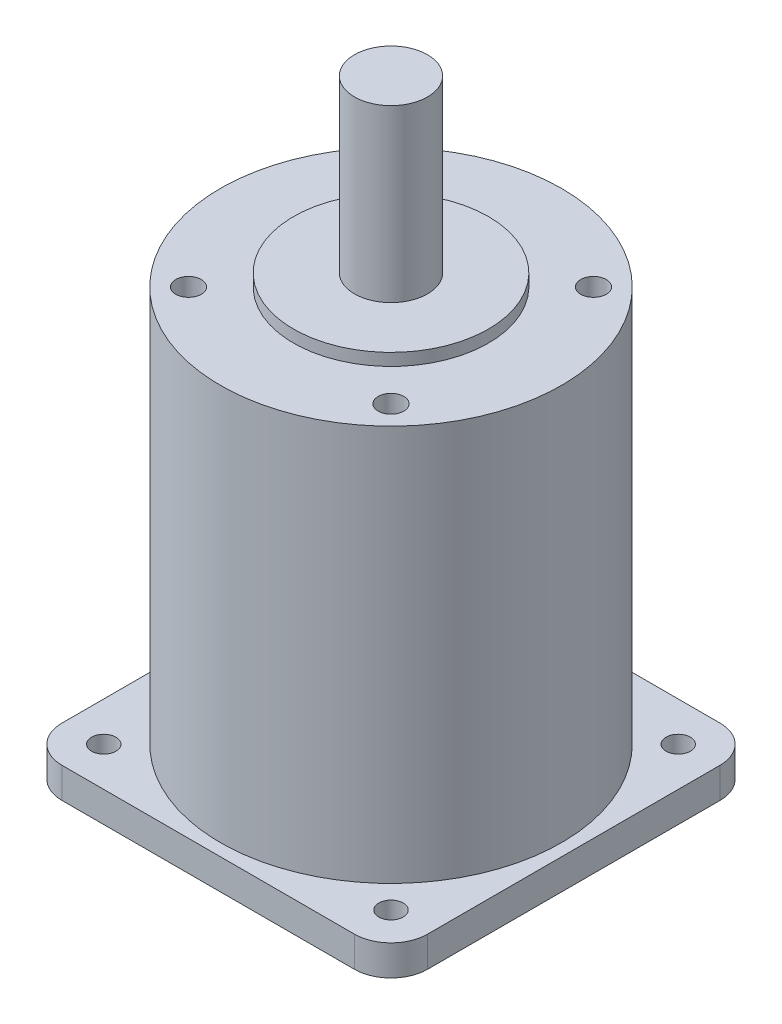
ISO-10303-21;
HEADER;
FILE_DESCRIPTION(('STEP AP214'),'2;1');
FILE_NAME('part.step','',(''),(''),'','','');
FILE_SCHEMA(('AUTOMOTIVE_DESIGN { 1 0 10303 214 1 1 1 1 }'));
ENDSEC;
DATA;
#1=APPLICATION_CONTEXT('core data for automotive mechanical design processes');
#2=APPLICATION_PROTOCOL_DEFINITION('international standard','automotive_design',2000,#1);
#3=PRODUCT_CONTEXT('',#1,'mechanical');
#4=PRODUCT('Part','Part','',(#3));
#5=PRODUCT_RELATED_PRODUCT_CATEGORY('part','',(#4));
#6=PRODUCT_DEFINITION_FORMATION('','',#4);
#7=PRODUCT_DEFINITION_CONTEXT('part definition',#1,'design');
#8=PRODUCT_DEFINITION('design','',#6,#7);
#9=PRODUCT_DEFINITION_SHAPE('','',#8);
#10=(LENGTH_UNIT() NAMED_UNIT(*) SI_UNIT(.MILLI.,.METRE.));
#11=(NAMED_UNIT(*) PLANE_ANGLE_UNIT() SI_UNIT($,.RADIAN.));
#12=(NAMED_UNIT(*) SI_UNIT($,.STERADIAN.) SOLID_ANGLE_UNIT());
#13=UNCERTAINTY_MEASURE_WITH_UNIT(LENGTH_MEASURE(1.E-05),#10,'distance_accuracy_value','');
#14=(GEOMETRIC_REPRESENTATION_CONTEXT(3) GLOBAL_UNCERTAINTY_ASSIGNED_CONTEXT((#13)) GLOBAL_UNIT_ASSIGNED_CONTEXT((#10,
#11,#12)) REPRESENTATION_CONTEXT('',''));
#15=CARTESIAN_POINT('',(0.,0.,0.));
#16=DIRECTION('',(0.,0.,1.));
#17=DIRECTION('',(1.,0.,0.));
#18=AXIS2_PLACEMENT_3D('',#15,#16,#17);
#19=CARTESIAN_POINT('',(0.,0.,0.));
#20=DIRECTION('',(0.,-1.,0.));
#21=DIRECTION('',(0.,0.,-1.));
#22=AXIS2_PLACEMENT_3D('',#19,#20,#21);
#23=CYLINDRICAL_SURFACE('',#22,28.);
#24=CARTESIAN_POINT('',(0.,65.,0.));
#25=DIRECTION('',(0.,-1.,0.));
#26=DIRECTION('',(0.,0.,-1.));
#27=AXIS2_PLACEMENT_3D('',#24,#25,#26);
#28=CIRCLE('',#27,28.);
#29=CARTESIAN_POINT('',(0.,65.,-28.));
#30=VERTEX_POINT('',#29);
#31=EDGE_CURVE('E203',#30,#30,#28,.T.);
#32=ORIENTED_EDGE('',*,*,#31,.T.);
#33=EDGE_LOOP('',(#32));
#34=FACE_BOUND('',#33,.T.);
#35=CARTESIAN_POINT('',(0.,0.,0.));
#36=DIRECTION('',(0.,-1.,0.));
#37=DIRECTION('',(0.,0.,-1.));
#38=AXIS2_PLACEMENT_3D('',#35,#36,#37);
#39=CIRCLE('',#38,28.);
#40=CARTESIAN_POINT('',(0.,0.,-28.));
#41=VERTEX_POINT('',#40);
#42=EDGE_CURVE('E206',#41,#41,#39,.T.);
#43=ORIENTED_EDGE('',*,*,#42,.F.);
#44=EDGE_LOOP('',(#43));
#45=FACE_BOUND('',#44,.T.);
#46=ADVANCED_FACE('F37',(#34,#45),#23,.T.);
#47=CARTESIAN_POINT('',(28.,65.,0.));
#48=DIRECTION('',(0.,1.,0.));
#49=DIRECTION('',(0.,0.,1.));
#50=AXIS2_PLACEMENT_3D('',#47,#48,#49);
#51=PLANE('',#50);
#52=CARTESIAN_POINT('',(-16.6170093578839,65.,-16.6170093578839));
#53=DIRECTION('',(0.,1.,0.));
#54=DIRECTION('',(0.,0.,1.));
#55=AXIS2_PLACEMENT_3D('',#52,#53,#54);
#56=CIRCLE('',#55,2.1);
#57=CARTESIAN_POINT('',(-16.6170093578839,65.,-14.5170093578839));
#58=VERTEX_POINT('',#57);
#59=EDGE_CURVE('E124',#58,#58,#56,.T.);
#60=ORIENTED_EDGE('',*,*,#59,.F.);
#61=EDGE_LOOP('',(#60));
#62=FACE_BOUND('',#61,.T.);
#63=CARTESIAN_POINT('',(16.6170093578839,65.,-16.6170093578839));
#64=DIRECTION('',(0.,1.,0.));
#65=DIRECTION('',(0.,0.,1.));
#66=AXIS2_PLACEMENT_3D('',#63,#64,#65);
#67=CIRCLE('',#66,2.1);
#68=CARTESIAN_POINT('',(16.6170093578839,65.,-14.5170093578839));
#69=VERTEX_POINT('',#68);
#70=EDGE_CURVE('E123',#69,#69,#67,.T.);
#71=ORIENTED_EDGE('',*,*,#70,.F.);
#72=EDGE_LOOP('',(#71));
#73=FACE_BOUND('',#72,.T.);
#74=CARTESIAN_POINT('',(16.6170093578839,65.,16.6170093578839));
#75=DIRECTION('',(0.,1.,0.));
#76=DIRECTION('',(0.,0.,1.));
#77=AXIS2_PLACEMENT_3D('',#74,#75,#76);
#78=CIRCLE('',#77,2.1);
#79=CARTESIAN_POINT('',(16.6170093578839,65.,18.7170093578839));
#80=VERTEX_POINT('',#79);
#81=EDGE_CURVE('E134',#80,#80,#78,.T.);
#82=ORIENTED_EDGE('',*,*,#81,.F.);
#83=EDGE_LOOP('',(#82));
#84=FACE_BOUND('',#83,.T.);
#85=CARTESIAN_POINT('',(-16.6170093578839,65.,16.6170093578839));
#86=DIRECTION('',(0.,1.,0.));
#87=DIRECTION('',(0.,0.,1.));
#88=AXIS2_PLACEMENT_3D('',#85,#86,#87);
#89=CIRCLE('',#88,2.1);
#90=CARTESIAN_POINT('',(-16.6170093578839,65.,18.7170093578839));
#91=VERTEX_POINT('',#90);
#92=EDGE_CURVE('E140',#91,#91,#89,.T.);
#93=ORIENTED_EDGE('',*,*,#92,.F.);
#94=EDGE_LOOP('',(#93));
#95=FACE_BOUND('',#94,.T.);
#96=CARTESIAN_POINT('',(0.,65.,0.));
#97=DIRECTION('',(0.,-1.,0.));
#98=DIRECTION('',(0.,0.,-1.));
#99=AXIS2_PLACEMENT_3D('',#96,#97,#98);
#100=CIRCLE('',#99,16.);
#101=CARTESIAN_POINT('',(0.,65.,-16.));
#102=VERTEX_POINT('',#101);
#103=EDGE_CURVE('E200',#102,#102,#100,.T.);
#104=ORIENTED_EDGE('',*,*,#103,.T.);
#105=EDGE_LOOP('',(#104));
#106=FACE_BOUND('',#105,.T.);
#107=ORIENTED_EDGE('',*,*,#31,.F.);
#108=EDGE_LOOP('',(#107));
#109=FACE_BOUND('',#108,.T.);
#110=ADVANCED_FACE('F281',(#62,#73,#84,#95,#106,#109),#51,.T.);
#111=CARTESIAN_POINT('',(0.,0.,0.));
#112=DIRECTION('',(0.,-1.,0.));
#113=DIRECTION('',(0.,0.,-1.));
#114=AXIS2_PLACEMENT_3D('',#111,#112,#113);
#115=CYLINDRICAL_SURFACE('',#114,16.);
#116=CARTESIAN_POINT('',(0.,67.,0.));
#117=DIRECTION('',(0.,-1.,0.));
#118=DIRECTION('',(0.,0.,-1.));
#119=AXIS2_PLACEMENT_3D('',#116,#117,#118);
#120=CIRCLE('',#119,16.);
#121=CARTESIAN_POINT('',(0.,67.,-16.));
#122=VERTEX_POINT('',#121);
#123=EDGE_CURVE('E197',#122,#122,#120,.T.);
#124=ORIENTED_EDGE('',*,*,#123,.T.);
#125=EDGE_LOOP('',(#124));
#126=FACE_BOUND('',#125,.T.);
#127=ORIENTED_EDGE('',*,*,#103,.F.);
#128=EDGE_LOOP('',(#127));
#129=FACE_BOUND('',#128,.T.);
#130=ADVANCED_FACE('F287',(#126,#129),#115,.T.);
#131=CARTESIAN_POINT('',(16.,67.,0.));
#132=DIRECTION('',(0.,1.,0.));
#133=DIRECTION('',(0.,0.,1.));
#134=AXIS2_PLACEMENT_3D('',#131,#132,#133);
#135=PLANE('',#134);
#136=CARTESIAN_POINT('',(0.,67.,0.));
#137=DIRECTION('',(0.,-1.,0.));
#138=DIRECTION('',(0.,0.,-1.));
#139=AXIS2_PLACEMENT_3D('',#136,#137,#138);
#140=CIRCLE('',#139,6.);
#141=CARTESIAN_POINT('',(0.,67.,-6.));
#142=VERTEX_POINT('',#141);
#143=EDGE_CURVE('E194',#142,#142,#140,.T.);
#144=ORIENTED_EDGE('',*,*,#143,.T.);
#145=EDGE_LOOP('',(#144));
#146=FACE_BOUND('',#145,.T.);
#147=ORIENTED_EDGE('',*,*,#123,.F.);
#148=EDGE_LOOP('',(#147));
#149=FACE_BOUND('',#148,.T.);
#150=ADVANCED_FACE('F294',(#146,#149),#135,.T.);
#151=CARTESIAN_POINT('',(0.,0.,0.));
#152=DIRECTION('',(0.,-1.,0.));
#153=DIRECTION('',(0.,0.,-1.));
#154=AXIS2_PLACEMENT_3D('',#151,#152,#153);
#155=CYLINDRICAL_SURFACE('',#154,6.);
#156=CARTESIAN_POINT('',(0.,95.,0.));
#157=DIRECTION('',(0.,-1.,0.));
#158=DIRECTION('',(0.,0.,-1.));
#159=AXIS2_PLACEMENT_3D('',#156,#157,#158);
#160=CIRCLE('',#159,5.99999999999999);
#161=CARTESIAN_POINT('',(0.,95.,-5.99999999999999));
#162=VERTEX_POINT('',#161);
#163=EDGE_CURVE('E182',#162,#162,#160,.T.);
#164=ORIENTED_EDGE('',*,*,#163,.T.);
#165=EDGE_LOOP('',(#164));
#166=FACE_BOUND('',#165,.T.);
#167=ORIENTED_EDGE('',*,*,#143,.F.);
#168=EDGE_LOOP('',(#167));
#169=FACE_BOUND('',#168,.T.);
#170=ADVANCED_FACE('F298',(#166,#169),#155,.T.);
#171=CARTESIAN_POINT('',(5.99999999999999,95.,0.));
#172=DIRECTION('',(0.,1.,0.));
#173=DIRECTION('',(0.,0.,1.));
#174=AXIS2_PLACEMENT_3D('',#171,#172,#173);
#175=PLANE('',#174);
#176=ORIENTED_EDGE('',*,*,#163,.F.);
#177=EDGE_LOOP('',(#176));
#178=FACE_BOUND('',#177,.T.);
#179=ADVANCED_FACE('F302',(#178),#175,.T.);
#180=CARTESIAN_POINT('',(-30.,-5.,30.));
#181=DIRECTION('',(1.,0.,0.));
#182=DIRECTION('',(0.,0.,-1.));
#183=AXIS2_PLACEMENT_3D('',#180,#181,#182);
#184=PLANE('',#183);
#185=DIRECTION('',(0.,0.,-1.));
#186=VECTOR('',#185,1.);
#187=CARTESIAN_POINT('',(-30.,0.,30.));
#188=LINE('',#187,#186);
#189=CARTESIAN_POINT('',(-30.,0.,24.));
#190=VERTEX_POINT('',#189);
#191=CARTESIAN_POINT('',(-30.,0.,-24.));
#192=VERTEX_POINT('',#191);
#193=EDGE_CURVE('E168',#190,#192,#188,.T.);
#194=ORIENTED_EDGE('',*,*,#193,.T.);
#195=DIRECTION('',(0.,1.,0.));
#196=VECTOR('',#195,1.);
#197=CARTESIAN_POINT('',(-30.,-5.,-24.));
#198=LINE('',#197,#196);
#199=CARTESIAN_POINT('',(-30.,-5.,-24.));
#200=VERTEX_POINT('',#199);
#201=EDGE_CURVE('E225',#192,#200,#198,.F.);
#202=ORIENTED_EDGE('',*,*,#201,.T.);
#203=DIRECTION('',(0.,0.,-1.));
#204=VECTOR('',#203,1.);
#205=CARTESIAN_POINT('',(-30.,-5.,30.));
#206=LINE('',#205,#204);
#207=CARTESIAN_POINT('',(-30.,-5.,24.));
#208=VERTEX_POINT('',#207);
#209=EDGE_CURVE('E171',#208,#200,#206,.T.);
#210=ORIENTED_EDGE('',*,*,#209,.F.);
#211=DIRECTION('',(0.,1.,0.));
#212=VECTOR('',#211,1.);
#213=CARTESIAN_POINT('',(-30.,-5.,24.));
#214=LINE('',#213,#212);
#215=EDGE_CURVE('E222',#208,#190,#214,.T.);
#216=ORIENTED_EDGE('',*,*,#215,.T.);
#217=EDGE_LOOP('',(#194,#202,#210,#216));
#218=FACE_BOUND('',#217,.T.);
#219=ADVANCED_FACE('F261',(#218),#184,.F.);
#220=CARTESIAN_POINT('',(-30.,-5.,-30.));
#221=DIRECTION('',(0.,0.,1.));
#222=DIRECTION('',(1.,0.,0.));
#223=AXIS2_PLACEMENT_3D('',#220,#221,#222);
#224=PLANE('',#223);
#225=DIRECTION('',(1.,0.,0.));
#226=VECTOR('',#225,1.);
#227=CARTESIAN_POINT('',(-30.,-5.,-30.));
#228=LINE('',#227,#226);
#229=CARTESIAN_POINT('',(-24.,-5.,-30.));
#230=VERTEX_POINT('',#229);
#231=CARTESIAN_POINT('',(24.,-5.,-30.));
#232=VERTEX_POINT('',#231);
#233=EDGE_CURVE('E174',#230,#232,#228,.T.);
#234=ORIENTED_EDGE('',*,*,#233,.F.);
#235=DIRECTION('',(0.,1.,0.));
#236=VECTOR('',#235,1.);
#237=CARTESIAN_POINT('',(-24.,-5.,-30.));
#238=LINE('',#237,#236);
#239=CARTESIAN_POINT('',(-24.,0.,-30.));
#240=VERTEX_POINT('',#239);
#241=EDGE_CURVE('E211',#230,#240,#238,.T.);
#242=ORIENTED_EDGE('',*,*,#241,.T.);
#243=DIRECTION('',(1.,0.,0.));
#244=VECTOR('',#243,1.);
#245=CARTESIAN_POINT('',(-30.,0.,-30.));
#246=LINE('',#245,#244);
#247=CARTESIAN_POINT('',(24.,0.,-30.));
#248=VERTEX_POINT('',#247);
#249=EDGE_CURVE('E185',#240,#248,#246,.T.);
#250=ORIENTED_EDGE('',*,*,#249,.T.);
#251=DIRECTION('',(0.,1.,0.));
#252=VECTOR('',#251,1.);
#253=CARTESIAN_POINT('',(24.,-5.,-30.));
#254=LINE('',#253,#252);
#255=EDGE_CURVE('E209',#248,#232,#254,.F.);
#256=ORIENTED_EDGE('',*,*,#255,.T.);
#257=EDGE_LOOP('',(#234,#242,#250,#256));
#258=FACE_BOUND('',#257,.T.);
#259=ADVANCED_FACE('F269',(#258),#224,.F.);
#260=CARTESIAN_POINT('',(30.,-5.,30.));
#261=DIRECTION('',(-1.,0.,0.));
#262=DIRECTION('',(0.,0.,1.));
#263=AXIS2_PLACEMENT_3D('',#260,#261,#262);
#264=PLANE('',#263);
#265=DIRECTION('',(0.,0.,1.));
#266=VECTOR('',#265,1.);
#267=CARTESIAN_POINT('',(30.,-5.,30.));
#268=LINE('',#267,#266);
#269=CARTESIAN_POINT('',(30.,-5.,-24.));
#270=VERTEX_POINT('',#269);
#271=CARTESIAN_POINT('',(30.,-5.,24.));
#272=VERTEX_POINT('',#271);
#273=EDGE_CURVE('E178',#270,#272,#268,.T.);
#274=ORIENTED_EDGE('',*,*,#273,.F.);
#275=DIRECTION('',(0.,1.,0.));
#276=VECTOR('',#275,1.);
#277=CARTESIAN_POINT('',(30.,-5.,-24.));
#278=LINE('',#277,#276);
#279=CARTESIAN_POINT('',(30.,0.,-24.));
#280=VERTEX_POINT('',#279);
#281=EDGE_CURVE('E236',#270,#280,#278,.T.);
#282=ORIENTED_EDGE('',*,*,#281,.T.);
#283=DIRECTION('',(0.,0.,1.));
#284=VECTOR('',#283,1.);
#285=CARTESIAN_POINT('',(30.,0.,30.));
#286=LINE('',#285,#284);
#287=CARTESIAN_POINT('',(30.,0.,24.));
#288=VERTEX_POINT('',#287);
#289=EDGE_CURVE('E188',#280,#288,#286,.T.);
#290=ORIENTED_EDGE('',*,*,#289,.T.);
#291=DIRECTION('',(0.,1.,0.));
#292=VECTOR('',#291,1.);
#293=CARTESIAN_POINT('',(30.,-5.,24.));
#294=LINE('',#293,#292);
#295=EDGE_CURVE('E234',#288,#272,#294,.F.);
#296=ORIENTED_EDGE('',*,*,#295,.T.);
#297=EDGE_LOOP('',(#274,#282,#290,#296));
#298=FACE_BOUND('',#297,.T.);
#299=ADVANCED_FACE('F242',(#298),#264,.F.);
#300=CARTESIAN_POINT('',(-30.,-5.,30.));
#301=DIRECTION('',(0.,0.,-1.));
#302=DIRECTION('',(-1.,0.,0.));
#303=AXIS2_PLACEMENT_3D('',#300,#301,#302);
#304=PLANE('',#303);
#305=DIRECTION('',(-1.,0.,0.));
#306=VECTOR('',#305,1.);
#307=CARTESIAN_POINT('',(-30.,-5.,30.));
#308=LINE('',#307,#306);
#309=CARTESIAN_POINT('',(24.,-5.,30.));
#310=VERTEX_POINT('',#309);
#311=CARTESIAN_POINT('',(-24.,-5.,30.));
#312=VERTEX_POINT('',#311);
#313=EDGE_CURVE('E180',#310,#312,#308,.T.);
#314=ORIENTED_EDGE('',*,*,#313,.F.);
#315=DIRECTION('',(0.,1.,0.));
#316=VECTOR('',#315,1.);
#317=CARTESIAN_POINT('',(24.,-5.,30.));
#318=LINE('',#317,#316);
#319=CARTESIAN_POINT('',(24.,0.,30.));
#320=VERTEX_POINT('',#319);
#321=EDGE_CURVE('E11',#310,#320,#318,.T.);
#322=ORIENTED_EDGE('',*,*,#321,.T.);
#323=DIRECTION('',(-1.,0.,0.));
#324=VECTOR('',#323,1.);
#325=CARTESIAN_POINT('',(-30.,0.,30.));
#326=LINE('',#325,#324);
#327=CARTESIAN_POINT('',(-24.,0.,30.));
#328=VERTEX_POINT('',#327);
#329=EDGE_CURVE('E175',#320,#328,#326,.T.);
#330=ORIENTED_EDGE('',*,*,#329,.T.);
#331=DIRECTION('',(0.,1.,0.));
#332=VECTOR('',#331,1.);
#333=CARTESIAN_POINT('',(-24.,-5.,30.));
#334=LINE('',#333,#332);
#335=EDGE_CURVE('E45',#328,#312,#334,.F.);
#336=ORIENTED_EDGE('',*,*,#335,.T.);
#337=EDGE_LOOP('',(#314,#322,#330,#336));
#338=FACE_BOUND('',#337,.T.);
#339=ADVANCED_FACE('F253',(#338),#304,.F.);
#340=CARTESIAN_POINT('',(0.,-5.,0.));
#341=DIRECTION('',(0.,-1.,0.));
#342=DIRECTION('',(0.,0.,-1.));
#343=AXIS2_PLACEMENT_3D('',#340,#341,#342);
#344=PLANE('',#343);
#345=CARTESIAN_POINT('',(23.57,-5.,-23.57));
#346=DIRECTION('',(0.,-1.,0.));
#347=DIRECTION('',(0.,0.,-1.));
#348=AXIS2_PLACEMENT_3D('',#345,#346,#347);
#349=CIRCLE('',#348,2.);
#350=CARTESIAN_POINT('',(23.57,-5.,-25.57));
#351=VERTEX_POINT('',#350);
#352=EDGE_CURVE('E146',#351,#351,#349,.T.);
#353=ORIENTED_EDGE('',*,*,#352,.F.);
#354=EDGE_LOOP('',(#353));
#355=FACE_BOUND('',#354,.T.);
#356=CARTESIAN_POINT('',(-23.57,-5.,-23.57));
#357=DIRECTION('',(0.,-1.,0.));
#358=DIRECTION('',(0.,0.,-1.));
#359=AXIS2_PLACEMENT_3D('',#356,#357,#358);
#360=CIRCLE('',#359,2.);
#361=CARTESIAN_POINT('',(-23.57,-5.,-25.57));
#362=VERTEX_POINT('',#361);
#363=EDGE_CURVE('E150',#362,#362,#360,.T.);
#364=ORIENTED_EDGE('',*,*,#363,.F.);
#365=EDGE_LOOP('',(#364));
#366=FACE_BOUND('',#365,.T.);
#367=CARTESIAN_POINT('',(23.57,-5.,23.57));
#368=DIRECTION('',(0.,-1.,0.));
#369=DIRECTION('',(0.,0.,-1.));
#370=AXIS2_PLACEMENT_3D('',#367,#368,#369);
#371=CIRCLE('',#370,2.);
#372=CARTESIAN_POINT('',(23.57,-5.,21.57));
#373=VERTEX_POINT('',#372);
#374=EDGE_CURVE('E156',#373,#373,#371,.T.);
#375=ORIENTED_EDGE('',*,*,#374,.F.);
#376=EDGE_LOOP('',(#375));
#377=FACE_BOUND('',#376,.T.);
#378=CARTESIAN_POINT('',(-23.57,-5.,23.57));
#379=DIRECTION('',(0.,-1.,0.));
#380=DIRECTION('',(0.,0.,-1.));
#381=AXIS2_PLACEMENT_3D('',#378,#379,#380);
#382=CIRCLE('',#381,2.);
#383=CARTESIAN_POINT('',(-23.57,-5.,21.57));
#384=VERTEX_POINT('',#383);
#385=EDGE_CURVE('E162',#384,#384,#382,.T.);
#386=ORIENTED_EDGE('',*,*,#385,.F.);
#387=EDGE_LOOP('',(#386));
#388=FACE_BOUND('',#387,.T.);
#389=ORIENTED_EDGE('',*,*,#209,.T.);
#390=CARTESIAN_POINT('',(-24.,-5.,-24.));
#391=DIRECTION('',(0.,-1.,0.));
#392=DIRECTION('',(0.,0.,-1.));
#393=AXIS2_PLACEMENT_3D('',#390,#391,#392);
#394=CIRCLE('',#393,6.);
#395=EDGE_CURVE('E232',#200,#230,#394,.T.);
#396=ORIENTED_EDGE('',*,*,#395,.T.);
#397=ORIENTED_EDGE('',*,*,#233,.T.);
#398=CARTESIAN_POINT('',(24.,-5.,-24.));
#399=DIRECTION('',(0.,-1.,0.));
#400=DIRECTION('',(0.,0.,-1.));
#401=AXIS2_PLACEMENT_3D('',#398,#399,#400);
#402=CIRCLE('',#401,6.);
#403=EDGE_CURVE('E230',#232,#270,#402,.T.);
#404=ORIENTED_EDGE('',*,*,#403,.T.);
#405=ORIENTED_EDGE('',*,*,#273,.T.);
#406=CARTESIAN_POINT('',(24.,-5.,24.));
#407=DIRECTION('',(0.,-1.,0.));
#408=DIRECTION('',(0.,0.,-1.));
#409=AXIS2_PLACEMENT_3D('',#406,#407,#408);
#410=CIRCLE('',#409,6.);
#411=EDGE_CURVE('E58',#272,#310,#410,.T.);
#412=ORIENTED_EDGE('',*,*,#411,.T.);
#413=ORIENTED_EDGE('',*,*,#313,.T.);
#414=CARTESIAN_POINT('',(-24.,-5.,24.));
#415=DIRECTION('',(0.,-1.,0.));
#416=DIRECTION('',(0.,0.,-1.));
#417=AXIS2_PLACEMENT_3D('',#414,#415,#416);
#418=CIRCLE('',#417,6.);
#419=EDGE_CURVE('E227',#312,#208,#418,.T.);
#420=ORIENTED_EDGE('',*,*,#419,.T.);
#421=EDGE_LOOP('',(#389,#396,#397,#404,#405,#412,#413,#420));
#422=FACE_BOUND('',#421,.T.);
#423=ADVANCED_FACE('F255',(#355,#366,#377,#388,#422),#344,.T.);
#424=CARTESIAN_POINT('',(0.,0.,0.));
#425=DIRECTION('',(0.,-1.,0.));
#426=DIRECTION('',(0.,0.,-1.));
#427=AXIS2_PLACEMENT_3D('',#424,#425,#426);
#428=PLANE('',#427);
#429=CARTESIAN_POINT('',(23.57,0.,-23.57));
#430=DIRECTION('',(0.,-1.,0.));
#431=DIRECTION('',(0.,0.,-1.));
#432=AXIS2_PLACEMENT_3D('',#429,#430,#431);
#433=CIRCLE('',#432,2.);
#434=CARTESIAN_POINT('',(23.57,0.,-25.57));
#435=VERTEX_POINT('',#434);
#436=EDGE_CURVE('E147',#435,#435,#433,.T.);
#437=ORIENTED_EDGE('',*,*,#436,.T.);
#438=EDGE_LOOP('',(#437));
#439=FACE_BOUND('',#438,.T.);
#440=CARTESIAN_POINT('',(-23.57,0.,-23.57));
#441=DIRECTION('',(0.,-1.,0.));
#442=DIRECTION('',(0.,0.,-1.));
#443=AXIS2_PLACEMENT_3D('',#440,#441,#442);
#444=CIRCLE('',#443,2.);
#445=CARTESIAN_POINT('',(-23.57,0.,-25.57));
#446=VERTEX_POINT('',#445);
#447=EDGE_CURVE('E153',#446,#446,#444,.T.);
#448=ORIENTED_EDGE('',*,*,#447,.T.);
#449=EDGE_LOOP('',(#448));
#450=FACE_BOUND('',#449,.T.);
#451=CARTESIAN_POINT('',(23.57,0.,23.57));
#452=DIRECTION('',(0.,-1.,0.));
#453=DIRECTION('',(0.,0.,-1.));
#454=AXIS2_PLACEMENT_3D('',#451,#452,#453);
#455=CIRCLE('',#454,2.);
#456=CARTESIAN_POINT('',(23.57,0.,21.57));
#457=VERTEX_POINT('',#456);
#458=EDGE_CURVE('E159',#457,#457,#455,.T.);
#459=ORIENTED_EDGE('',*,*,#458,.T.);
#460=EDGE_LOOP('',(#459));
#461=FACE_BOUND('',#460,.T.);
#462=CARTESIAN_POINT('',(-23.57,0.,23.57));
#463=DIRECTION('',(0.,-1.,0.));
#464=DIRECTION('',(0.,0.,-1.));
#465=AXIS2_PLACEMENT_3D('',#462,#463,#464);
#466=CIRCLE('',#465,2.);
#467=CARTESIAN_POINT('',(-23.57,0.,21.57));
#468=VERTEX_POINT('',#467);
#469=EDGE_CURVE('E165',#468,#468,#466,.T.);
#470=ORIENTED_EDGE('',*,*,#469,.T.);
#471=EDGE_LOOP('',(#470));
#472=FACE_BOUND('',#471,.T.);
#473=ORIENTED_EDGE('',*,*,#42,.T.);
#474=EDGE_LOOP('',(#473));
#475=FACE_BOUND('',#474,.T.);
#476=ORIENTED_EDGE('',*,*,#249,.F.);
#477=CARTESIAN_POINT('',(-24.,0.,-24.));
#478=DIRECTION('',(0.,-1.,0.));
#479=DIRECTION('',(0.,0.,-1.));
#480=AXIS2_PLACEMENT_3D('',#477,#478,#479);
#481=CIRCLE('',#480,6.);
#482=EDGE_CURVE('E220',#240,#192,#481,.F.);
#483=ORIENTED_EDGE('',*,*,#482,.T.);
#484=ORIENTED_EDGE('',*,*,#193,.F.);
#485=CARTESIAN_POINT('',(-24.,0.,24.));
#486=DIRECTION('',(0.,-1.,0.));
#487=DIRECTION('',(0.,0.,-1.));
#488=AXIS2_PLACEMENT_3D('',#485,#486,#487);
#489=CIRCLE('',#488,6.);
#490=EDGE_CURVE('E214',#190,#328,#489,.F.);
#491=ORIENTED_EDGE('',*,*,#490,.T.);
#492=ORIENTED_EDGE('',*,*,#329,.F.);
#493=CARTESIAN_POINT('',(24.,0.,24.));
#494=DIRECTION('',(0.,-1.,0.));
#495=DIRECTION('',(0.,0.,-1.));
#496=AXIS2_PLACEMENT_3D('',#493,#494,#495);
#497=CIRCLE('',#496,6.);
#498=EDGE_CURVE('E216',#320,#288,#497,.F.);
#499=ORIENTED_EDGE('',*,*,#498,.T.);
#500=ORIENTED_EDGE('',*,*,#289,.F.);
#501=CARTESIAN_POINT('',(24.,0.,-24.));
#502=DIRECTION('',(0.,-1.,0.));
#503=DIRECTION('',(0.,0.,-1.));
#504=AXIS2_PLACEMENT_3D('',#501,#502,#503);
#505=CIRCLE('',#504,6.);
#506=EDGE_CURVE('E218',#280,#248,#505,.F.);
#507=ORIENTED_EDGE('',*,*,#506,.T.);
#508=EDGE_LOOP('',(#476,#483,#484,#491,#492,#499,#500,#507));
#509=FACE_BOUND('',#508,.T.);
#510=ADVANCED_FACE('F248',(#439,#450,#461,#472,#475,#509),#428,.F.);
#511=CARTESIAN_POINT('',(-23.57,0.,23.57));
#512=DIRECTION('',(0.,-1.,0.));
#513=DIRECTION('',(0.,0.,-1.));
#514=AXIS2_PLACEMENT_3D('',#511,#512,#513);
#515=CYLINDRICAL_SURFACE('',#514,2.);
#516=ORIENTED_EDGE('',*,*,#469,.F.);
#517=EDGE_LOOP('',(#516));
#518=FACE_BOUND('',#517,.T.);
#519=ORIENTED_EDGE('',*,*,#385,.T.);
#520=EDGE_LOOP('',(#519));
#521=FACE_BOUND('',#520,.T.);
#522=ADVANCED_FACE('F317',(#518,#521),#515,.F.);
#523=CARTESIAN_POINT('',(23.57,0.,23.57));
#524=DIRECTION('',(0.,-1.,0.));
#525=DIRECTION('',(0.,0.,-1.));
#526=AXIS2_PLACEMENT_3D('',#523,#524,#525);
#527=CYLINDRICAL_SURFACE('',#526,2.);
#528=ORIENTED_EDGE('',*,*,#458,.F.);
#529=EDGE_LOOP('',(#528));
#530=FACE_BOUND('',#529,.T.);
#531=ORIENTED_EDGE('',*,*,#374,.T.);
#532=EDGE_LOOP('',(#531));
#533=FACE_BOUND('',#532,.T.);
#534=ADVANCED_FACE('F324',(#530,#533),#527,.F.);
#535=CARTESIAN_POINT('',(-23.57,0.,-23.57));
#536=DIRECTION('',(0.,-1.,0.));
#537=DIRECTION('',(0.,0.,-1.));
#538=AXIS2_PLACEMENT_3D('',#535,#536,#537);
#539=CYLINDRICAL_SURFACE('',#538,2.);
#540=ORIENTED_EDGE('',*,*,#447,.F.);
#541=EDGE_LOOP('',(#540));
#542=FACE_BOUND('',#541,.T.);
#543=ORIENTED_EDGE('',*,*,#363,.T.);
#544=EDGE_LOOP('',(#543));
#545=FACE_BOUND('',#544,.T.);
#546=ADVANCED_FACE('F328',(#542,#545),#539,.F.);
#547=CARTESIAN_POINT('',(23.57,0.,-23.57));
#548=DIRECTION('',(0.,-1.,0.));
#549=DIRECTION('',(0.,0.,-1.));
#550=AXIS2_PLACEMENT_3D('',#547,#548,#549);
#551=CYLINDRICAL_SURFACE('',#550,2.);
#552=ORIENTED_EDGE('',*,*,#436,.F.);
#553=EDGE_LOOP('',(#552));
#554=FACE_BOUND('',#553,.T.);
#555=ORIENTED_EDGE('',*,*,#352,.T.);
#556=EDGE_LOOP('',(#555));
#557=FACE_BOUND('',#556,.T.);
#558=ADVANCED_FACE('F278',(#554,#557),#551,.F.);
#559=CARTESIAN_POINT('',(-24.,-5.,-24.));
#560=DIRECTION('',(0.,1.,0.));
#561=DIRECTION('',(0.,0.,1.));
#562=AXIS2_PLACEMENT_3D('',#559,#560,#561);
#563=CYLINDRICAL_SURFACE('',#562,6.);
#564=ORIENTED_EDGE('',*,*,#395,.F.);
#565=ORIENTED_EDGE('',*,*,#201,.F.);
#566=ORIENTED_EDGE('',*,*,#482,.F.);
#567=ORIENTED_EDGE('',*,*,#241,.F.);
#568=EDGE_LOOP('',(#564,#565,#566,#567));
#569=FACE_BOUND('',#568,.T.);
#570=ADVANCED_FACE('F266',(#569),#563,.T.);
#571=CARTESIAN_POINT('',(24.,-5.,-24.));
#572=DIRECTION('',(0.,1.,0.));
#573=DIRECTION('',(0.,0.,1.));
#574=AXIS2_PLACEMENT_3D('',#571,#572,#573);
#575=CYLINDRICAL_SURFACE('',#574,6.);
#576=ORIENTED_EDGE('',*,*,#403,.F.);
#577=ORIENTED_EDGE('',*,*,#255,.F.);
#578=ORIENTED_EDGE('',*,*,#506,.F.);
#579=ORIENTED_EDGE('',*,*,#281,.F.);
#580=EDGE_LOOP('',(#576,#577,#578,#579));
#581=FACE_BOUND('',#580,.T.);
#582=ADVANCED_FACE('F271',(#581),#575,.T.);
#583=CARTESIAN_POINT('',(24.,-5.,24.));
#584=DIRECTION('',(0.,1.,0.));
#585=DIRECTION('',(0.,0.,1.));
#586=AXIS2_PLACEMENT_3D('',#583,#584,#585);
#587=CYLINDRICAL_SURFACE('',#586,6.);
#588=ORIENTED_EDGE('',*,*,#411,.F.);
#589=ORIENTED_EDGE('',*,*,#295,.F.);
#590=ORIENTED_EDGE('',*,*,#498,.F.);
#591=ORIENTED_EDGE('',*,*,#321,.F.);
#592=EDGE_LOOP('',(#588,#589,#590,#591));
#593=FACE_BOUND('',#592,.T.);
#594=ADVANCED_FACE('F252',(#593),#587,.T.);
#595=CARTESIAN_POINT('',(-24.,-5.,24.));
#596=DIRECTION('',(0.,1.,0.));
#597=DIRECTION('',(0.,0.,1.));
#598=AXIS2_PLACEMENT_3D('',#595,#596,#597);
#599=CYLINDRICAL_SURFACE('',#598,6.);
#600=ORIENTED_EDGE('',*,*,#419,.F.);
#601=ORIENTED_EDGE('',*,*,#335,.F.);
#602=ORIENTED_EDGE('',*,*,#490,.F.);
#603=ORIENTED_EDGE('',*,*,#215,.F.);
#604=EDGE_LOOP('',(#600,#601,#602,#603));
#605=FACE_BOUND('',#604,.T.);
#606=ADVANCED_FACE('F39',(#605),#599,.T.);
#607=CARTESIAN_POINT('',(-16.6170093578839,41.,16.6170093578839));
#608=DIRECTION('',(0.,1.,0.));
#609=DIRECTION('',(0.,0.,1.));
#610=AXIS2_PLACEMENT_3D('',#607,#608,#609);
#611=CONICAL_SURFACE('',#610,2.1,1.02974425867665);
#612=CARTESIAN_POINT('',(-16.6170093578839,39.7381927000421,16.6170093578839));
#613=VERTEX_POINT('',#612);
#614=VERTEX_LOOP('',#613);
#615=FACE_BOUND('',#614,.T.);
#616=CARTESIAN_POINT('',(-16.6170093578839,41.,16.6170093578839));
#617=DIRECTION('',(0.,1.,0.));
#618=DIRECTION('',(0.,0.,1.));
#619=AXIS2_PLACEMENT_3D('',#616,#617,#618);
#620=CIRCLE('',#619,2.1);
#621=CARTESIAN_POINT('',(-16.6170093578839,41.,18.7170093578839));
#622=VERTEX_POINT('',#621);
#623=EDGE_CURVE('E143',#622,#622,#620,.T.);
#624=ORIENTED_EDGE('',*,*,#623,.T.);
#625=EDGE_LOOP('',(#624));
#626=FACE_BOUND('',#625,.T.);
#627=ADVANCED_FACE('F336',(#615,#626),#611,.F.);
#628=CARTESIAN_POINT('',(-16.6170093578839,65.,16.6170093578839));
#629=DIRECTION('',(0.,1.,0.));
#630=DIRECTION('',(0.,0.,1.));
#631=AXIS2_PLACEMENT_3D('',#628,#629,#630);
#632=CYLINDRICAL_SURFACE('',#631,2.1);
#633=ORIENTED_EDGE('',*,*,#623,.F.);
#634=EDGE_LOOP('',(#633));
#635=FACE_BOUND('',#634,.T.);
#636=ORIENTED_EDGE('',*,*,#92,.T.);
#637=EDGE_LOOP('',(#636));
#638=FACE_BOUND('',#637,.T.);
#639=ADVANCED_FACE('F339',(#635,#638),#632,.F.);
#640=CARTESIAN_POINT('',(16.6170093578839,41.,16.6170093578839));
#641=DIRECTION('',(0.,1.,0.));
#642=DIRECTION('',(0.,0.,1.));
#643=AXIS2_PLACEMENT_3D('',#640,#641,#642);
#644=CONICAL_SURFACE('',#643,2.09999999999999,1.02974425867665);
#645=CARTESIAN_POINT('',(16.6170093578839,39.7381927000421,16.6170093578839));
#646=VERTEX_POINT('',#645);
#647=VERTEX_LOOP('',#646);
#648=FACE_BOUND('',#647,.T.);
#649=CARTESIAN_POINT('',(16.6170093578839,41.,16.6170093578839));
#650=DIRECTION('',(0.,1.,0.));
#651=DIRECTION('',(0.,0.,1.));
#652=AXIS2_PLACEMENT_3D('',#649,#650,#651);
#653=CIRCLE('',#652,2.09999999999999);
#654=CARTESIAN_POINT('',(16.6170093578839,41.,18.7170093578839));
#655=VERTEX_POINT('',#654);
#656=EDGE_CURVE('E137',#655,#655,#653,.T.);
#657=ORIENTED_EDGE('',*,*,#656,.T.);
#658=EDGE_LOOP('',(#657));
#659=FACE_BOUND('',#658,.T.);
#660=ADVANCED_FACE('F343',(#648,#659),#644,.F.);
#661=CARTESIAN_POINT('',(16.6170093578839,65.,16.6170093578839));
#662=DIRECTION('',(0.,1.,0.));
#663=DIRECTION('',(0.,0.,1.));
#664=AXIS2_PLACEMENT_3D('',#661,#662,#663);
#665=CYLINDRICAL_SURFACE('',#664,2.1);
#666=ORIENTED_EDGE('',*,*,#656,.F.);
#667=EDGE_LOOP('',(#666));
#668=FACE_BOUND('',#667,.T.);
#669=ORIENTED_EDGE('',*,*,#81,.T.);
#670=EDGE_LOOP('',(#669));
#671=FACE_BOUND('',#670,.T.);
#672=ADVANCED_FACE('F347',(#668,#671),#665,.F.);
#673=CARTESIAN_POINT('',(16.6170093578839,41.,-16.6170093578839));
#674=DIRECTION('',(0.,1.,0.));
#675=DIRECTION('',(0.,0.,1.));
#676=AXIS2_PLACEMENT_3D('',#673,#674,#675);
#677=CONICAL_SURFACE('',#676,2.09999999999999,1.02974425867665);
#678=CARTESIAN_POINT('',(16.6170093578839,39.7381927000421,-16.6170093578839));
#679=VERTEX_POINT('',#678);
#680=VERTEX_LOOP('',#679);
#681=FACE_BOUND('',#680,.T.);
#682=CARTESIAN_POINT('',(16.6170093578839,41.,-16.6170093578839));
#683=DIRECTION('',(0.,1.,0.));
#684=DIRECTION('',(0.,0.,1.));
#685=AXIS2_PLACEMENT_3D('',#682,#683,#684);
#686=CIRCLE('',#685,2.09999999999999);
#687=CARTESIAN_POINT('',(16.6170093578839,41.,-14.5170093578839));
#688=VERTEX_POINT('',#687);
#689=EDGE_CURVE('E127',#688,#688,#686,.T.);
#690=ORIENTED_EDGE('',*,*,#689,.T.);
#691=EDGE_LOOP('',(#690));
#692=FACE_BOUND('',#691,.T.);
#693=ADVANCED_FACE('F351',(#681,#692),#677,.F.);
#694=CARTESIAN_POINT('',(16.6170093578839,65.,-16.6170093578839));
#695=DIRECTION('',(0.,1.,0.));
#696=DIRECTION('',(0.,0.,1.));
#697=AXIS2_PLACEMENT_3D('',#694,#695,#696);
#698=CYLINDRICAL_SURFACE('',#697,2.1);
#699=ORIENTED_EDGE('',*,*,#689,.F.);
#700=EDGE_LOOP('',(#699));
#701=FACE_BOUND('',#700,.T.);
#702=ORIENTED_EDGE('',*,*,#70,.T.);
#703=EDGE_LOOP('',(#702));
#704=FACE_BOUND('',#703,.T.);
#705=ADVANCED_FACE('F117',(#701,#704),#698,.F.);
#706=CARTESIAN_POINT('',(-16.6170093578839,41.,-16.6170093578839));
#707=DIRECTION('',(0.,1.,0.));
#708=DIRECTION('',(0.,0.,1.));
#709=AXIS2_PLACEMENT_3D('',#706,#707,#708);
#710=CONICAL_SURFACE('',#709,2.1,1.02974425867665);
#711=CARTESIAN_POINT('',(-16.6170093578839,39.7381927000421,-16.6170093578839));
#712=VERTEX_POINT('',#711);
#713=VERTEX_LOOP('',#712);
#714=FACE_BOUND('',#713,.T.);
#715=CARTESIAN_POINT('',(-16.6170093578839,41.,-16.6170093578839));
#716=DIRECTION('',(0.,1.,0.));
#717=DIRECTION('',(0.,0.,1.));
#718=AXIS2_PLACEMENT_3D('',#715,#716,#717);
#719=CIRCLE('',#718,2.1);
#720=CARTESIAN_POINT('',(-16.6170093578839,41.,-14.5170093578839));
#721=VERTEX_POINT('',#720);
#722=EDGE_CURVE('E121',#721,#721,#719,.T.);
#723=ORIENTED_EDGE('',*,*,#722,.T.);
#724=EDGE_LOOP('',(#723));
#725=FACE_BOUND('',#724,.T.);
#726=ADVANCED_FACE('F113',(#714,#725),#710,.F.);
#727=CARTESIAN_POINT('',(-16.6170093578839,65.,-16.6170093578839));
#728=DIRECTION('',(0.,1.,0.));
#729=DIRECTION('',(0.,0.,1.));
#730=AXIS2_PLACEMENT_3D('',#727,#728,#729);
#731=CYLINDRICAL_SURFACE('',#730,2.1);
#732=ORIENTED_EDGE('',*,*,#722,.F.);
#733=EDGE_LOOP('',(#732));
#734=FACE_BOUND('',#733,.T.);
#735=ORIENTED_EDGE('',*,*,#59,.T.);
#736=EDGE_LOOP('',(#735));
#737=FACE_BOUND('',#736,.T.);
#738=ADVANCED_FACE('F116',(#734,#737),#731,.F.);
#739=CLOSED_SHELL('',(#46,#110,#130,#150,#170,#179,#219,#259,#299,#339,#423,#510,#522,#534,#546,
#558,#570,#582,#594,#606,#627,#639,#660,#672,#693,#705,#726,#738));
#740=MANIFOLD_SOLID_BREP('B2',#739);
#741=ADVANCED_BREP_SHAPE_REPRESENTATION('',(#18,#740),#14);
#742=SHAPE_DEFINITION_REPRESENTATION(#9,#741);
ENDSEC;
END-ISO-10303-21;
